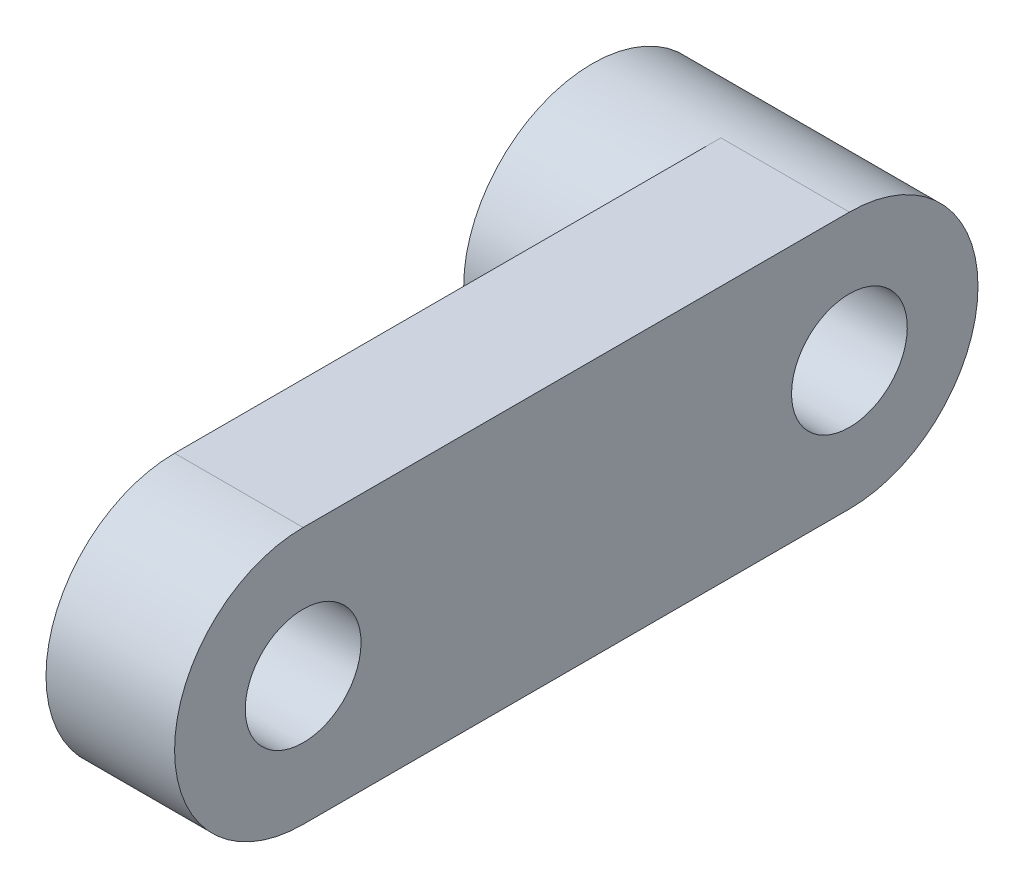
ISO-10303-21;
HEADER;
FILE_DESCRIPTION(('STEP AP214'),'2;1');
FILE_NAME('part.step','',(''),(''),'','','');
FILE_SCHEMA(('AUTOMOTIVE_DESIGN { 1 0 10303 214 1 1 1 1 }'));
ENDSEC;
DATA;
#1=APPLICATION_CONTEXT('core data for automotive mechanical design processes');
#2=APPLICATION_PROTOCOL_DEFINITION('international standard','automotive_design',2000,#1);
#3=PRODUCT_CONTEXT('',#1,'mechanical');
#4=PRODUCT('Part','Part','',(#3));
#5=PRODUCT_RELATED_PRODUCT_CATEGORY('part','',(#4));
#6=PRODUCT_DEFINITION_FORMATION('','',#4);
#7=PRODUCT_DEFINITION_CONTEXT('part definition',#1,'design');
#8=PRODUCT_DEFINITION('design','',#6,#7);
#9=PRODUCT_DEFINITION_SHAPE('','',#8);
#10=(LENGTH_UNIT() NAMED_UNIT(*) SI_UNIT(.MILLI.,.METRE.));
#11=(NAMED_UNIT(*) PLANE_ANGLE_UNIT() SI_UNIT($,.RADIAN.));
#12=(NAMED_UNIT(*) SI_UNIT($,.STERADIAN.) SOLID_ANGLE_UNIT());
#13=UNCERTAINTY_MEASURE_WITH_UNIT(LENGTH_MEASURE(1.E-05),#10,'distance_accuracy_value','');
#14=(GEOMETRIC_REPRESENTATION_CONTEXT(3) GLOBAL_UNCERTAINTY_ASSIGNED_CONTEXT((#13)) GLOBAL_UNIT_ASSIGNED_CONTEXT((#10,
#11,#12)) REPRESENTATION_CONTEXT('',''));
#15=CARTESIAN_POINT('',(0.,0.,0.));
#16=DIRECTION('',(0.,0.,1.));
#17=DIRECTION('',(1.,0.,0.));
#18=AXIS2_PLACEMENT_3D('',#15,#16,#17);
#19=CARTESIAN_POINT('',(-2.5,10.,0.));
#20=DIRECTION('',(0.,-1.,0.));
#21=DIRECTION('',(0.,0.,-1.));
#22=AXIS2_PLACEMENT_3D('',#19,#20,#21);
#23=PLANE('',#22);
#24=DIRECTION('',(-1.,0.,0.));
#25=VECTOR('',#24,1.);
#26=CARTESIAN_POINT('',(0.,10.,-10.6213245889));
#27=LINE('',#26,#25);
#28=CARTESIAN_POINT('',(0.,10.,-10.6213245895));
#29=VERTEX_POINT('',#28);
#30=CARTESIAN_POINT('',(-5.,10.,-10.6213245895));
#31=VERTEX_POINT('',#30);
#32=EDGE_CURVE('E113',#29,#31,#27,.T.);
#33=ORIENTED_EDGE('',*,*,#32,.T.);
#34=DIRECTION('',(0.,0.,1.));
#35=VECTOR('',#34,1.);
#36=CARTESIAN_POINT('',(-5.,10.,0.));
#37=LINE('',#36,#35);
#38=CARTESIAN_POINT('',(-5.,10.,10.6213245895));
#39=VERTEX_POINT('',#38);
#40=EDGE_CURVE('E112',#31,#39,#37,.T.);
#41=ORIENTED_EDGE('',*,*,#40,.T.);
#42=DIRECTION('',(-1.,0.,0.));
#43=VECTOR('',#42,1.);
#44=CARTESIAN_POINT('',(0.,10.,10.6213245889));
#45=LINE('',#44,#43);
#46=CARTESIAN_POINT('',(0.,10.,10.6213245895));
#47=VERTEX_POINT('',#46);
#48=EDGE_CURVE('E11',#47,#39,#45,.T.);
#49=ORIENTED_EDGE('',*,*,#48,.F.);
#50=DIRECTION('',(0.,0.,1.));
#51=VECTOR('',#50,1.);
#52=CARTESIAN_POINT('',(0.,10.,0.));
#53=LINE('',#52,#51);
#54=EDGE_CURVE('E130',#29,#47,#53,.T.);
#55=ORIENTED_EDGE('',*,*,#54,.F.);
#56=EDGE_LOOP('',(#33,#41,#49,#55));
#57=FACE_BOUND('',#56,.T.);
#58=ADVANCED_FACE('F17',(#57),#23,.F.);
#59=CARTESIAN_POINT('',(0.,5.,10.6213245889));
#60=DIRECTION('',(-1.,0.,0.));
#61=DIRECTION('',(0.,-1.,0.));
#62=AXIS2_PLACEMENT_3D('',#59,#60,#61);
#63=CYLINDRICAL_SURFACE('',#62,5.);
#64=ORIENTED_EDGE('',*,*,#48,.T.);
#65=CARTESIAN_POINT('',(-5.,5.,10.6213245895));
#66=DIRECTION('',(1.,0.,0.));
#67=DIRECTION('',(0.,1.,0.));
#68=AXIS2_PLACEMENT_3D('',#65,#66,#67);
#69=CIRCLE('',#68,5.);
#70=CARTESIAN_POINT('',(-5.,0.,10.6213245895));
#71=VERTEX_POINT('',#70);
#72=EDGE_CURVE('E103',#39,#71,#69,.T.);
#73=ORIENTED_EDGE('',*,*,#72,.T.);
#74=DIRECTION('',(-1.,0.,0.));
#75=VECTOR('',#74,1.);
#76=CARTESIAN_POINT('',(-2.5,0.,10.6213245895));
#77=LINE('',#76,#75);
#78=CARTESIAN_POINT('',(0.,0.,10.6213245895));
#79=VERTEX_POINT('',#78);
#80=EDGE_CURVE('E29',#79,#71,#77,.T.);
#81=ORIENTED_EDGE('',*,*,#80,.F.);
#82=CARTESIAN_POINT('',(0.,5.,10.6213245895));
#83=DIRECTION('',(1.,0.,0.));
#84=DIRECTION('',(0.,1.,0.));
#85=AXIS2_PLACEMENT_3D('',#82,#83,#84);
#86=CIRCLE('',#85,5.);
#87=EDGE_CURVE('E106',#47,#79,#86,.T.);
#88=ORIENTED_EDGE('',*,*,#87,.F.);
#89=EDGE_LOOP('',(#64,#73,#81,#88));
#90=FACE_BOUND('',#89,.T.);
#91=ADVANCED_FACE('F101',(#90),#63,.T.);
#92=CARTESIAN_POINT('',(-2.5,0.,0.));
#93=DIRECTION('',(0.,1.,0.));
#94=DIRECTION('',(1.,0.,0.));
#95=AXIS2_PLACEMENT_3D('',#92,#93,#94);
#96=PLANE('',#95);
#97=DIRECTION('',(-1.,0.,0.));
#98=VECTOR('',#97,1.);
#99=CARTESIAN_POINT('',(0.,1.00364161426E-13,-10.6213245889));
#100=LINE('',#99,#98);
#101=CARTESIAN_POINT('',(0.,0.,-10.6213245895));
#102=VERTEX_POINT('',#101);
#103=CARTESIAN_POINT('',(-5.,0.,-10.6213245895));
#104=VERTEX_POINT('',#103);
#105=EDGE_CURVE('E135',#102,#104,#100,.T.);
#106=ORIENTED_EDGE('',*,*,#105,.F.);
#107=DIRECTION('',(0.,0.,-1.));
#108=VECTOR('',#107,1.);
#109=CARTESIAN_POINT('',(0.,0.,0.));
#110=LINE('',#109,#108);
#111=EDGE_CURVE('E134',#79,#102,#110,.T.);
#112=ORIENTED_EDGE('',*,*,#111,.F.);
#113=ORIENTED_EDGE('',*,*,#80,.T.);
#114=DIRECTION('',(0.,0.,-1.));
#115=VECTOR('',#114,1.);
#116=CARTESIAN_POINT('',(-5.,0.,0.));
#117=LINE('',#116,#115);
#118=EDGE_CURVE('E121',#71,#104,#117,.T.);
#119=ORIENTED_EDGE('',*,*,#118,.T.);
#120=EDGE_LOOP('',(#106,#112,#113,#119));
#121=FACE_BOUND('',#120,.T.);
#122=ADVANCED_FACE('F228',(#121),#96,.F.);
#123=CARTESIAN_POINT('',(0.,5.,-10.6213245889));
#124=DIRECTION('',(-1.,0.,0.));
#125=DIRECTION('',(0.,1.,0.));
#126=AXIS2_PLACEMENT_3D('',#123,#124,#125);
#127=CYLINDRICAL_SURFACE('',#126,2.25);
#128=CARTESIAN_POINT('',(-10.,5.,-10.6213245897));
#129=DIRECTION('',(-1.,0.,0.));
#130=DIRECTION('',(0.,-1.,0.));
#131=AXIS2_PLACEMENT_3D('',#128,#129,#130);
#132=CIRCLE('',#131,2.25);
#133=CARTESIAN_POINT('',(-10.,2.75,-10.6213245897));
#134=VERTEX_POINT('',#133);
#135=EDGE_CURVE('E149',#134,#134,#132,.T.);
#136=ORIENTED_EDGE('',*,*,#135,.T.);
#137=EDGE_LOOP('',(#136));
#138=FACE_BOUND('',#137,.T.);
#139=CARTESIAN_POINT('',(0.,7.25,-10.6213245895));
#140=CARTESIAN_POINT('',(0.,7.25,-10.8417763343));
#141=CARTESIAN_POINT('',(0.,7.22300057123,-11.0622276549));
#142=CARTESIAN_POINT('',(0.,7.16899429942,-11.2782808507));
#143=CARTESIAN_POINT('',(0.,7.00918056558,-11.6927348055));
#144=CARTESIAN_POINT('',(0.,6.75407251207,-12.0563704674));
#145=CARTESIAN_POINT('',(0.,6.60475763263,-12.2215997982));
#146=CARTESIAN_POINT('',(0.,6.26872561077,-12.5121079518));
#147=CARTESIAN_POINT('',(0.,5.87251953218,-12.7129356238));
#148=CARTESIAN_POINT('',(0.,5.66302060875,-12.7884728243));
#149=CARTESIAN_POINT('',(0.,5.22981787748,-12.8866965545));
#150=CARTESIAN_POINT('',(0.,4.78571658988,-12.8774738915));
#151=CARTESIAN_POINT('',(0.,4.56531579404,-12.8455497216));
#152=CARTESIAN_POINT('',(0.,4.13684819566,-12.7283830505));
#153=CARTESIAN_POINT('',(0.,3.74932129954,-12.5112795726));
#154=CARTESIAN_POINT('',(0.,3.56986532448,-12.3794038281));
#155=CARTESIAN_POINT('',(0.,3.24692482229,-12.074408833));
#156=CARTESIAN_POINT('',(0.,3.00713346393,-11.7004955771));
#157=CARTESIAN_POINT('',(0.,2.91083720789,-11.4996904745));
#158=CARTESIAN_POINT('',(0.,2.81094827254,-11.2023255391));
#159=CARTESIAN_POINT('',(0.,2.76382278313,-10.8941446112));
#160=CARTESIAN_POINT('',(0.,2.75459194466,-10.8031542565));
#161=CARTESIAN_POINT('',(0.,2.75,-10.7122393869));
#162=CARTESIAN_POINT('',(0.,2.75,-10.6213245895));
#163=B_SPLINE_CURVE_WITH_KNOTS('',5,(#139,#140,#141,#142,#143,#144,#145,#146,#147,#148,#149,
#150,#151,#152,#153,#154,#155,#156,#157,#158,#159,#160,#161,#162),.UNSPECIFIED.,.F.,.F.,(6,3,3,
3,3,3,3,6),(0.,1.55882923689,3.11765845869,4.67648767169,6.23531689785,7.79414614322,
9.35297539459,9.99584009246),.UNSPECIFIED.);
#164=CARTESIAN_POINT('',(0.,7.25,-10.6213245889));
#165=VERTEX_POINT('',#164);
#166=CARTESIAN_POINT('',(0.,2.75,-10.6213245889));
#167=VERTEX_POINT('',#166);
#168=EDGE_CURVE('E204',#165,#167,#163,.T.);
#169=ORIENTED_EDGE('',*,*,#168,.F.);
#170=CARTESIAN_POINT('',(0.,2.75,-10.6213245895));
#171=CARTESIAN_POINT('',(0.,2.75,-10.4008728444));
#172=CARTESIAN_POINT('',(0.,2.77699942882,-10.1804215237));
#173=CARTESIAN_POINT('',(0.,2.83100570043,-9.96436832673));
#174=CARTESIAN_POINT('',(0.,2.9908194345,-9.54991437126));
#175=CARTESIAN_POINT('',(0.,3.24592748858,-9.18627870874));
#176=CARTESIAN_POINT('',(0.,3.39524236651,-9.02104938152));
#177=CARTESIAN_POINT('',(0.,3.73127439219,-8.73054122443));
#178=CARTESIAN_POINT('',(0.,4.127480476,-8.52971355102));
#179=CARTESIAN_POINT('',(0.,4.33697938231,-8.45417635667));
#180=CARTESIAN_POINT('',(0.,4.77018211875,-8.35595262417));
#181=CARTESIAN_POINT('',(0.,5.21428341179,-8.36517528753));
#182=CARTESIAN_POINT('',(0.,5.43468420435,-8.397099455));
#183=CARTESIAN_POINT('',(0.,5.86315180426,-8.5142661264));
#184=CARTESIAN_POINT('',(0.,6.25067870164,-8.73136960517));
#185=CARTESIAN_POINT('',(0.,6.43013467453,-8.86324534995));
#186=CARTESIAN_POINT('',(0.,6.75307517761,-9.1682403456));
#187=CARTESIAN_POINT('',(0.,6.99286653646,-9.54215360251));
#188=CARTESIAN_POINT('',(0.,7.08916279188,-9.74295870193));
#189=CARTESIAN_POINT('',(0.,7.18905172747,-10.0403236378));
#190=CARTESIAN_POINT('',(0.,7.23617721693,-10.3485045662));
#191=CARTESIAN_POINT('',(0.,7.24540805532,-10.4394949221));
#192=CARTESIAN_POINT('',(0.,7.25,-10.5304097918));
#193=CARTESIAN_POINT('',(0.,7.25,-10.6213245895));
#194=B_SPLINE_CURVE_WITH_KNOTS('',5,(#170,#171,#172,#173,#174,#175,#176,#177,#178,#179,#180,
#181,#182,#183,#184,#185,#186,#187,#188,#189,#190,#191,#192,#193),.UNSPECIFIED.,.F.,.F.,(6,3,3,
3,3,3,3,6),(0.,1.55882923835,3.11765846412,4.67648770933,6.23531694135,7.79414619147,
9.35297544538,9.99584014456),.UNSPECIFIED.);
#195=EDGE_CURVE('E197',#167,#165,#194,.T.);
#196=ORIENTED_EDGE('',*,*,#195,.F.);
#197=EDGE_LOOP('',(#169,#196));
#198=FACE_BOUND('',#197,.T.);
#199=ADVANCED_FACE('F243',(#138,#198),#127,.F.);
#200=CARTESIAN_POINT('',(0.,5.,10.6213245889));
#201=DIRECTION('',(-1.,0.,0.));
#202=DIRECTION('',(0.,1.,0.));
#203=AXIS2_PLACEMENT_3D('',#200,#201,#202);
#204=CYLINDRICAL_SURFACE('',#203,2.25);
#205=CARTESIAN_POINT('',(-5.,2.75,10.6213245895));
#206=CARTESIAN_POINT('',(-5.,2.75,10.8417763343));
#207=CARTESIAN_POINT('',(-5.,2.77699942877,11.0622276549));
#208=CARTESIAN_POINT('',(-5.,2.83100570058,11.2782808507));
#209=CARTESIAN_POINT('',(-5.,2.99081943442,11.6927348055));
#210=CARTESIAN_POINT('',(-5.,3.24592748793,12.0563704674));
#211=CARTESIAN_POINT('',(-5.,3.39524236736,12.2215997982));
#212=CARTESIAN_POINT('',(-5.,3.73127438923,12.5121079518));
#213=CARTESIAN_POINT('',(-5.,4.12748046782,12.7129356238));
#214=CARTESIAN_POINT('',(-5.,4.33697939125,12.7884728243));
#215=CARTESIAN_POINT('',(-5.,4.77018212252,12.8866965545));
#216=CARTESIAN_POINT('',(-5.,5.21428341012,12.8774738915));
#217=CARTESIAN_POINT('',(-5.,5.43468420596,12.8455497216));
#218=CARTESIAN_POINT('',(-5.,5.86315180433,12.7283830505));
#219=CARTESIAN_POINT('',(-5.,6.25067870045,12.5112795726));
#220=CARTESIAN_POINT('',(-5.,6.43013467552,12.3794038281));
#221=CARTESIAN_POINT('',(-5.,6.75307517771,12.074408833));
#222=CARTESIAN_POINT('',(-5.,6.99286653607,11.700495577));
#223=CARTESIAN_POINT('',(-5.,7.08916279211,11.4996904745));
#224=CARTESIAN_POINT('',(-5.,7.18905172746,11.2023255391));
#225=CARTESIAN_POINT('',(-5.,7.23617721687,10.8941446112));
#226=CARTESIAN_POINT('',(-5.,7.24540805534,10.8031542565));
#227=CARTESIAN_POINT('',(-5.,7.25,10.7122393869));
#228=CARTESIAN_POINT('',(-5.,7.25,10.6213245895));
#229=B_SPLINE_CURVE_WITH_KNOTS('',5,(#205,#206,#207,#208,#209,#210,#211,#212,#213,#214,#215,
#216,#217,#218,#219,#220,#221,#222,#223,#224,#225,#226,#227,#228),.UNSPECIFIED.,.F.,.F.,(6,3,3,
3,3,3,3,6),(0.,1.55882923689,3.11765845871,4.67648767171,6.23531689788,7.79414614322,
9.3529753946,9.99584009247),.UNSPECIFIED.);
#230=CARTESIAN_POINT('',(-5.,2.75,10.6213245889));
#231=VERTEX_POINT('',#230);
#232=CARTESIAN_POINT('',(-5.,7.25,10.6213245889));
#233=VERTEX_POINT('',#232);
#234=EDGE_CURVE('E118',#231,#233,#229,.T.);
#235=ORIENTED_EDGE('',*,*,#234,.T.);
#236=CARTESIAN_POINT('',(-5.,7.25,10.6213245895));
#237=CARTESIAN_POINT('',(-5.,7.25,10.4008728444));
#238=CARTESIAN_POINT('',(-5.,7.22300057118,10.1804215237));
#239=CARTESIAN_POINT('',(-5.,7.16899429957,9.96436832673));
#240=CARTESIAN_POINT('',(-5.,7.0091805655,9.54991437126));
#241=CARTESIAN_POINT('',(-5.,6.75407251142,9.18627870874));
#242=CARTESIAN_POINT('',(-5.,6.60475763349,9.02104938152));
#243=CARTESIAN_POINT('',(-5.,6.26872560781,8.73054122443));
#244=CARTESIAN_POINT('',(-5.,5.872519524,8.52971355102));
#245=CARTESIAN_POINT('',(-5.,5.66302061769,8.45417635667));
#246=CARTESIAN_POINT('',(-5.,5.22981788125,8.35595262417));
#247=CARTESIAN_POINT('',(-5.,4.78571658822,8.36517528753));
#248=CARTESIAN_POINT('',(-5.,4.56531579564,8.39709945501));
#249=CARTESIAN_POINT('',(-5.,4.13684819573,8.5142661264));
#250=CARTESIAN_POINT('',(-5.,3.74932129836,8.73136960517));
#251=CARTESIAN_POINT('',(-5.,3.56986532547,8.86324534995));
#252=CARTESIAN_POINT('',(-5.,3.24692482239,9.1682403456));
#253=CARTESIAN_POINT('',(-5.,3.00713346354,9.54215360251));
#254=CARTESIAN_POINT('',(-5.,2.91083720812,9.74295870193));
#255=CARTESIAN_POINT('',(-5.,2.81094827253,10.0403236378));
#256=CARTESIAN_POINT('',(-5.,2.76382278307,10.3485045662));
#257=CARTESIAN_POINT('',(-5.,2.75459194468,10.4394949221));
#258=CARTESIAN_POINT('',(-5.,2.75,10.5304097918));
#259=CARTESIAN_POINT('',(-5.,2.75,10.6213245895));
#260=B_SPLINE_CURVE_WITH_KNOTS('',5,(#236,#237,#238,#239,#240,#241,#242,#243,#244,#245,#246,
#247,#248,#249,#250,#251,#252,#253,#254,#255,#256,#257,#258,#259),.UNSPECIFIED.,.F.,.F.,(6,3,3,
3,3,3,3,6),(0.,1.55882923834,3.11765846412,4.67648770932,6.23531694132,7.79414619145,
9.35297544537,9.99584014455),.UNSPECIFIED.);
#261=EDGE_CURVE('E41',#233,#231,#260,.T.);
#262=ORIENTED_EDGE('',*,*,#261,.T.);
#263=EDGE_LOOP('',(#235,#262));
#264=FACE_BOUND('',#263,.T.);
#265=CARTESIAN_POINT('',(0.,7.25,10.6213245895));
#266=CARTESIAN_POINT('',(0.,7.25,10.4008728444));
#267=CARTESIAN_POINT('',(0.,7.22300057118,10.1804215237));
#268=CARTESIAN_POINT('',(0.,7.16899429957,9.96436832673));
#269=CARTESIAN_POINT('',(0.,7.0091805655,9.54991437126));
#270=CARTESIAN_POINT('',(0.,6.75407251142,9.18627870874));
#271=CARTESIAN_POINT('',(0.,6.60475763349,9.02104938152));
#272=CARTESIAN_POINT('',(0.,6.26872560781,8.73054122443));
#273=CARTESIAN_POINT('',(0.,5.872519524,8.52971355102));
#274=CARTESIAN_POINT('',(0.,5.66302061769,8.45417635667));
#275=CARTESIAN_POINT('',(0.,5.22981788125,8.35595262417));
#276=CARTESIAN_POINT('',(0.,4.78571658822,8.36517528753));
#277=CARTESIAN_POINT('',(0.,4.56531579564,8.39709945501));
#278=CARTESIAN_POINT('',(0.,4.13684819573,8.5142661264));
#279=CARTESIAN_POINT('',(0.,3.74932129836,8.73136960517));
#280=CARTESIAN_POINT('',(0.,3.56986532547,8.86324534995));
#281=CARTESIAN_POINT('',(0.,3.24692482239,9.1682403456));
#282=CARTESIAN_POINT('',(0.,3.00713346354,9.54215360251));
#283=CARTESIAN_POINT('',(0.,2.91083720812,9.74295870193));
#284=CARTESIAN_POINT('',(0.,2.81094827253,10.0403236378));
#285=CARTESIAN_POINT('',(0.,2.76382278307,10.3485045662));
#286=CARTESIAN_POINT('',(0.,2.75459194468,10.4394949221));
#287=CARTESIAN_POINT('',(0.,2.75,10.5304097918));
#288=CARTESIAN_POINT('',(0.,2.75,10.6213245895));
#289=B_SPLINE_CURVE_WITH_KNOTS('',5,(#265,#266,#267,#268,#269,#270,#271,#272,#273,#274,#275,
#276,#277,#278,#279,#280,#281,#282,#283,#284,#285,#286,#287,#288),.UNSPECIFIED.,.F.,.F.,(6,3,3,
3,3,3,3,6),(0.,1.55882923834,3.11765846412,4.67648770932,6.23531694132,7.79414619145,
9.35297544537,9.99584014455),.UNSPECIFIED.);
#290=CARTESIAN_POINT('',(0.,7.25,10.6213245889));
#291=VERTEX_POINT('',#290);
#292=CARTESIAN_POINT('',(0.,2.75,10.6213245889));
#293=VERTEX_POINT('',#292);
#294=EDGE_CURVE('E188',#291,#293,#289,.T.);
#295=ORIENTED_EDGE('',*,*,#294,.F.);
#296=CARTESIAN_POINT('',(0.,2.75,10.6213245895));
#297=CARTESIAN_POINT('',(0.,2.75,10.8417763343));
#298=CARTESIAN_POINT('',(0.,2.77699942877,11.0622276549));
#299=CARTESIAN_POINT('',(0.,2.83100570058,11.2782808507));
#300=CARTESIAN_POINT('',(0.,2.99081943442,11.6927348055));
#301=CARTESIAN_POINT('',(0.,3.24592748793,12.0563704674));
#302=CARTESIAN_POINT('',(0.,3.39524236736,12.2215997982));
#303=CARTESIAN_POINT('',(0.,3.73127438923,12.5121079518));
#304=CARTESIAN_POINT('',(0.,4.12748046782,12.7129356238));
#305=CARTESIAN_POINT('',(0.,4.33697939125,12.7884728243));
#306=CARTESIAN_POINT('',(0.,4.77018212252,12.8866965545));
#307=CARTESIAN_POINT('',(0.,5.21428341012,12.8774738915));
#308=CARTESIAN_POINT('',(0.,5.43468420596,12.8455497216));
#309=CARTESIAN_POINT('',(0.,5.86315180433,12.7283830505));
#310=CARTESIAN_POINT('',(0.,6.25067870045,12.5112795726));
#311=CARTESIAN_POINT('',(0.,6.43013467552,12.3794038281));
#312=CARTESIAN_POINT('',(0.,6.75307517771,12.074408833));
#313=CARTESIAN_POINT('',(0.,6.99286653607,11.700495577));
#314=CARTESIAN_POINT('',(0.,7.08916279211,11.4996904745));
#315=CARTESIAN_POINT('',(0.,7.18905172746,11.2023255391));
#316=CARTESIAN_POINT('',(0.,7.23617721687,10.8941446112));
#317=CARTESIAN_POINT('',(0.,7.24540805534,10.8031542565));
#318=CARTESIAN_POINT('',(0.,7.25,10.7122393869));
#319=CARTESIAN_POINT('',(0.,7.25,10.6213245895));
#320=B_SPLINE_CURVE_WITH_KNOTS('',5,(#296,#297,#298,#299,#300,#301,#302,#303,#304,#305,#306,
#307,#308,#309,#310,#311,#312,#313,#314,#315,#316,#317,#318,#319),.UNSPECIFIED.,.F.,.F.,(6,3,3,
3,3,3,3,6),(0.,1.55882923689,3.11765845871,4.67648767171,6.23531689788,7.79414614322,
9.3529753946,9.99584009247),.UNSPECIFIED.);
#321=EDGE_CURVE('E146',#293,#291,#320,.T.);
#322=ORIENTED_EDGE('',*,*,#321,.F.);
#323=EDGE_LOOP('',(#295,#322));
#324=FACE_BOUND('',#323,.T.);
#325=ADVANCED_FACE('F249',(#264,#324),#204,.F.);
#326=CARTESIAN_POINT('',(-10.,5.,-9.28157862676));
#327=DIRECTION('',(-1.,0.,0.));
#328=DIRECTION('',(0.,0.,1.));
#329=AXIS2_PLACEMENT_3D('',#326,#327,#328);
#330=PLANE('',#329);
#331=ORIENTED_EDGE('',*,*,#135,.F.);
#332=EDGE_LOOP('',(#331));
#333=FACE_BOUND('',#332,.T.);
#334=CARTESIAN_POINT('',(-10.,5.,-10.6213245889));
#335=DIRECTION('',(1.,0.,0.));
#336=DIRECTION('',(0.,-1.,0.));
#337=AXIS2_PLACEMENT_3D('',#334,#335,#336);
#338=CIRCLE('',#337,5.);
#339=CARTESIAN_POINT('',(-10.,1.89182003396E-13,-10.6213245889));
#340=VERTEX_POINT('',#339);
#341=CARTESIAN_POINT('',(-10.,10.,-10.6213245889));
#342=VERTEX_POINT('',#341);
#343=EDGE_CURVE('E142',#340,#342,#338,.T.);
#344=ORIENTED_EDGE('',*,*,#343,.F.);
#345=CARTESIAN_POINT('',(-10.,10.,-10.6213245897));
#346=CARTESIAN_POINT('',(-10.,10.,-10.0736108837));
#347=CARTESIAN_POINT('',(-10.,9.92500242406,-9.52589770798));
#348=CARTESIAN_POINT('',(-10.,9.774974975,-8.99183839892));
#349=CARTESIAN_POINT('',(-10.,9.33258960862,-7.97854807968));
#350=CARTESIAN_POINT('',(-10.,8.63409981479,-7.12147781185));
#351=CARTESIAN_POINT('',(-10.,8.22791113317,-6.74367053331));
#352=CARTESIAN_POINT('',(-10.,7.32257597179,-6.10898137787));
#353=CARTESIAN_POINT('',(-10.,6.27995190991,-5.74102418396));
#354=CARTESIAN_POINT('',(-10.,5.73644248136,-5.63000575265));
#355=CARTESIAN_POINT('',(-10.,4.63303559736,-5.55961168494));
#356=CARTESIAN_POINT('',(-10.,3.55132258383,-5.7884224922));
#357=CARTESIAN_POINT('',(-10.,3.02950947006,-5.97667408267));
#358=CARTESIAN_POINT('',(-10.,2.05085968934,-6.4911706181));
#359=CARTESIAN_POINT('',(-10.,1.24653947463,-7.24980519622));
#360=CARTESIAN_POINT('',(-10.,0.899091934242,-7.68224917446));
#361=CARTESIAN_POINT('',(-10.,0.406518096288,-8.50573759511));
#362=CARTESIAN_POINT('',(-10.,0.121798818439,-9.41783479579));
#363=CARTESIAN_POINT('',(-10.,0.0405977879151,-9.81536859257));
#364=CARTESIAN_POINT('',(-10.,-1.00364161426E-13,-10.2183467347));
#365=CARTESIAN_POINT('',(-10.,-1.00364161426E-13,-10.6213245897));
#366=B_SPLINE_CURVE_WITH_KNOTS('',5,(#345,#346,#347,#348,#349,#350,#351,#352,#353,#354,#355,
#356,#357,#358,#359,#360,#361,#362,#363,#364,#365),.UNSPECIFIED.,.F.,.F.,(6,3,3,3,3,3,6),(0.,
3.8729207569,7.74584151081,11.618762252,15.4916829999,19.3646037467,22.2140874865),.UNSPECIFIED.);
#367=EDGE_CURVE('E153',#342,#340,#366,.T.);
#368=ORIENTED_EDGE('',*,*,#367,.F.);
#369=EDGE_LOOP('',(#344,#368));
#370=FACE_BOUND('',#369,.T.);
#371=ADVANCED_FACE('F264',(#333,#370),#330,.T.);
#372=CARTESIAN_POINT('',(-5.,5.,0.));
#373=DIRECTION('',(1.,0.,0.));
#374=DIRECTION('',(0.,1.,0.));
#375=AXIS2_PLACEMENT_3D('',#372,#373,#374);
#376=PLANE('',#375);
#377=ORIENTED_EDGE('',*,*,#234,.F.);
#378=ORIENTED_EDGE('',*,*,#261,.F.);
#379=EDGE_LOOP('',(#377,#378));
#380=FACE_BOUND('',#379,.T.);
#381=CARTESIAN_POINT('',(-5.,0.,-10.6213245895));
#382=CARTESIAN_POINT('',(-5.,0.,-10.0736108837));
#383=CARTESIAN_POINT('',(-5.,0.0749975758705,-9.52589770825));
#384=CARTESIAN_POINT('',(-5.,0.225025025224,-8.99183839814));
#385=CARTESIAN_POINT('',(-5.,0.6674103923,-7.97854807748));
#386=CARTESIAN_POINT('',(-5.,1.36590018756,-7.12147780869));
#387=CARTESIAN_POINT('',(-5.,1.77208886378,-6.74367053704));
#388=CARTESIAN_POINT('',(-5.,2.67742402849,-6.10898137865));
#389=CARTESIAN_POINT('',(-5.,3.72004809479,-5.74102418389));
#390=CARTESIAN_POINT('',(-5.,4.26355751367,-5.63000575269));
#391=CARTESIAN_POINT('',(-5.,5.36696439921,-5.55961168422));
#392=CARTESIAN_POINT('',(-5.,6.44867741422,-5.78842249151));
#393=CARTESIAN_POINT('',(-5.,6.97049053171,-5.97667408333));
#394=CARTESIAN_POINT('',(-5.,7.9491403108,-6.4911706182));
#395=CARTESIAN_POINT('',(-5.,8.75346052441,-7.24980519503));
#396=CARTESIAN_POINT('',(-5.,9.10090806644,-7.68224917533));
#397=CARTESIAN_POINT('',(-5.,9.59348190375,-8.5057375952));
#398=CARTESIAN_POINT('',(-5.,9.87820118137,-9.41783479491));
#399=CARTESIAN_POINT('',(-5.,9.95940221216,-9.81536859293));
#400=CARTESIAN_POINT('',(-5.,10.,-10.2183467347));
#401=CARTESIAN_POINT('',(-5.,10.,-10.6213245895));
#402=B_SPLINE_CURVE_WITH_KNOTS('',5,(#381,#382,#383,#384,#385,#386,#387,#388,#389,#390,#391,
#392,#393,#394,#395,#396,#397,#398,#399,#400,#401),.UNSPECIFIED.,.F.,.F.,(6,3,3,3,3,3,6),(0.,
3.87292075497,7.74584152193,11.6187622806,15.4916830215,19.3646037636,22.2140875012),.UNSPECIFIED.);
#403=EDGE_CURVE('E127',#104,#31,#402,.T.);
#404=ORIENTED_EDGE('',*,*,#403,.F.);
#405=ORIENTED_EDGE('',*,*,#118,.F.);
#406=ORIENTED_EDGE('',*,*,#72,.F.);
#407=ORIENTED_EDGE('',*,*,#40,.F.);
#408=EDGE_LOOP('',(#404,#405,#406,#407));
#409=FACE_BOUND('',#408,.T.);
#410=ADVANCED_FACE('F120',(#380,#409),#376,.F.);
#411=CARTESIAN_POINT('',(0.,5.,-10.6213245889));
#412=DIRECTION('',(-1.,0.,0.));
#413=DIRECTION('',(0.,1.,0.));
#414=AXIS2_PLACEMENT_3D('',#411,#412,#413);
#415=CYLINDRICAL_SURFACE('',#414,5.);
#416=ORIENTED_EDGE('',*,*,#367,.T.);
#417=ORIENTED_EDGE('',*,*,#343,.T.);
#418=EDGE_LOOP('',(#416,#417));
#419=FACE_BOUND('',#418,.T.);
#420=ORIENTED_EDGE('',*,*,#105,.T.);
#421=ORIENTED_EDGE('',*,*,#403,.T.);
#422=ORIENTED_EDGE('',*,*,#32,.F.);
#423=CARTESIAN_POINT('',(0.,10.,-10.6213245895));
#424=CARTESIAN_POINT('',(0.,10.,-11.1690382941));
#425=CARTESIAN_POINT('',(0.,9.92500242445,-11.7167514683));
#426=CARTESIAN_POINT('',(0.,9.77497497383,-12.250810783));
#427=CARTESIAN_POINT('',(0.,9.33258960823,-13.2641010995));
#428=CARTESIAN_POINT('',(0.,8.63409981647,-14.1211713653));
#429=CARTESIAN_POINT('',(0.,8.22791113099,-14.4989786456));
#430=CARTESIAN_POINT('',(0.,7.32257596909,-15.1336678009));
#431=CARTESIAN_POINT('',(0.,6.27995190659,-15.5016249946));
#432=CARTESIAN_POINT('',(0.,5.73644248488,-15.6126434245));
#433=CARTESIAN_POINT('',(0.,4.6330355974,-15.6830374929));
#434=CARTESIAN_POINT('',(0.,3.55132258053,-15.4542266845));
#435=CARTESIAN_POINT('',(0.,3.02950947304,-15.2659750963));
#436=CARTESIAN_POINT('',(0.,2.05085968957,-14.7514785599));
#437=CARTESIAN_POINT('',(0.,1.24653947299,-13.9928439796));
#438=CARTESIAN_POINT('',(0.,0.899091935395,-13.5604000048));
#439=CARTESIAN_POINT('',(0.,0.406518096877,-12.7369115837));
#440=CARTESIAN_POINT('',(0.,0.121798818735,-11.8248143825));
#441=CARTESIAN_POINT('',(0.,0.0405977878154,-11.4272805857));
#442=CARTESIAN_POINT('',(0.,0.,-11.024302444));
#443=CARTESIAN_POINT('',(0.,0.,-10.6213245895));
#444=B_SPLINE_CURVE_WITH_KNOTS('',5,(#423,#424,#425,#426,#427,#428,#429,#430,#431,#432,#433,
#434,#435,#436,#437,#438,#439,#440,#441,#442,#443),.UNSPECIFIED.,.F.,.F.,(6,3,3,3,3,3,6),(0.,
3.87292074666,7.74584149126,11.6187622448,15.4916830045,19.3646037592,22.2140874954),.UNSPECIFIED.);
#445=EDGE_CURVE('E20',#29,#102,#444,.T.);
#446=ORIENTED_EDGE('',*,*,#445,.T.);
#447=EDGE_LOOP('',(#420,#421,#422,#446));
#448=FACE_BOUND('',#447,.T.);
#449=ADVANCED_FACE('F223',(#419,#448),#415,.T.);
#450=CARTESIAN_POINT('',(0.,5.,0.));
#451=DIRECTION('',(1.,0.,0.));
#452=DIRECTION('',(0.,1.,0.));
#453=AXIS2_PLACEMENT_3D('',#450,#451,#452);
#454=PLANE('',#453);
#455=ORIENTED_EDGE('',*,*,#294,.T.);
#456=ORIENTED_EDGE('',*,*,#321,.T.);
#457=EDGE_LOOP('',(#455,#456));
#458=FACE_BOUND('',#457,.T.);
#459=ORIENTED_EDGE('',*,*,#168,.T.);
#460=ORIENTED_EDGE('',*,*,#195,.T.);
#461=EDGE_LOOP('',(#459,#460));
#462=FACE_BOUND('',#461,.T.);
#463=ORIENTED_EDGE('',*,*,#54,.T.);
#464=ORIENTED_EDGE('',*,*,#87,.T.);
#465=ORIENTED_EDGE('',*,*,#111,.T.);
#466=ORIENTED_EDGE('',*,*,#445,.F.);
#467=EDGE_LOOP('',(#463,#464,#465,#466));
#468=FACE_BOUND('',#467,.T.);
#469=ADVANCED_FACE('F226',(#458,#462,#468),#454,.T.);
#470=CLOSED_SHELL('',(#58,#91,#122,#199,#325,#371,#410,#449,#469));
#471=MANIFOLD_SOLID_BREP('B1',#470);
#472=ADVANCED_BREP_SHAPE_REPRESENTATION('',(#18,#471),#14);
#473=SHAPE_DEFINITION_REPRESENTATION(#9,#472);
ENDSEC;
END-ISO-10303-21;
